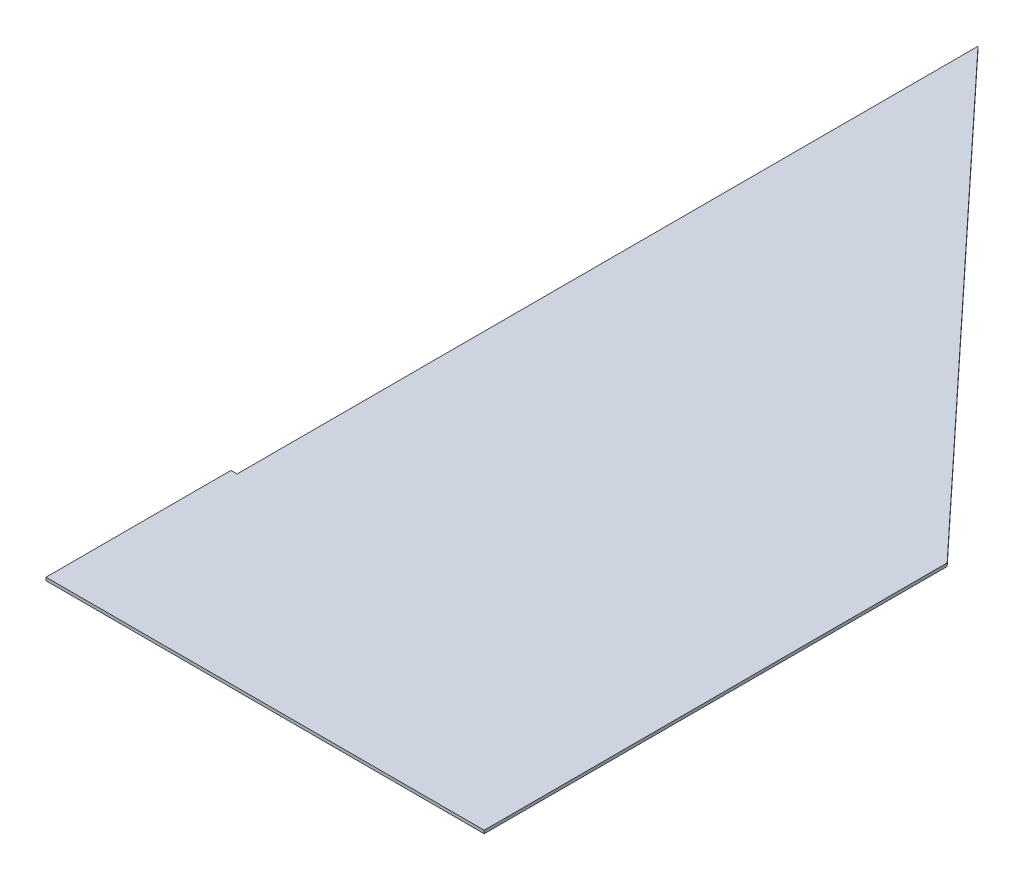
ISO-10303-21;
HEADER;
FILE_DESCRIPTION(('STEP AP214'),'2;1');
FILE_NAME('part.step','',(''),(''),'','','');
FILE_SCHEMA(('AUTOMOTIVE_DESIGN { 1 0 10303 214 1 1 1 1 }'));
ENDSEC;
DATA;
#1=APPLICATION_CONTEXT('core data for automotive mechanical design processes');
#2=APPLICATION_PROTOCOL_DEFINITION('international standard','automotive_design',2000,#1);
#3=PRODUCT_CONTEXT('',#1,'mechanical');
#4=PRODUCT('Part','Part','',(#3));
#5=PRODUCT_RELATED_PRODUCT_CATEGORY('part','',(#4));
#6=PRODUCT_DEFINITION_FORMATION('','',#4);
#7=PRODUCT_DEFINITION_CONTEXT('part definition',#1,'design');
#8=PRODUCT_DEFINITION('design','',#6,#7);
#9=PRODUCT_DEFINITION_SHAPE('','',#8);
#10=(LENGTH_UNIT() NAMED_UNIT(*) SI_UNIT(.MILLI.,.METRE.));
#11=(NAMED_UNIT(*) PLANE_ANGLE_UNIT() SI_UNIT($,.RADIAN.));
#12=(NAMED_UNIT(*) SI_UNIT($,.STERADIAN.) SOLID_ANGLE_UNIT());
#13=UNCERTAINTY_MEASURE_WITH_UNIT(LENGTH_MEASURE(1.E-05),#10,'distance_accuracy_value','');
#14=(GEOMETRIC_REPRESENTATION_CONTEXT(3) GLOBAL_UNCERTAINTY_ASSIGNED_CONTEXT((#13)) GLOBAL_UNIT_ASSIGNED_CONTEXT((#10,
#11,#12)) REPRESENTATION_CONTEXT('',''));
#15=CARTESIAN_POINT('',(0.,0.,0.));
#16=DIRECTION('',(0.,0.,1.));
#17=DIRECTION('',(1.,0.,0.));
#18=AXIS2_PLACEMENT_3D('',#15,#16,#17);
#19=CARTESIAN_POINT('',(140.,1.,-150.));
#20=DIRECTION('',(-0.731055268242869,0.,0.682318250360011));
#21=DIRECTION('',(0.682318250360011,0.,0.731055268242869));
#22=AXIS2_PLACEMENT_3D('',#19,#20,#21);
#23=PLANE('',#22);
#24=DIRECTION('',(-0.682318250360011,0.,-0.731055268242869));
#25=VECTOR('',#24,1.);
#26=CARTESIAN_POINT('',(140.,0.,-150.));
#27=LINE('',#26,#25);
#28=CARTESIAN_POINT('',(140.,0.,-150.));
#29=VERTEX_POINT('',#28);
#30=CARTESIAN_POINT('',(0.,0.,-300.));
#31=VERTEX_POINT('',#30);
#32=EDGE_CURVE('E117',#29,#31,#27,.T.);
#33=ORIENTED_EDGE('',*,*,#32,.T.);
#34=DIRECTION('',(0.,-1.,0.));
#35=VECTOR('',#34,1.);
#36=CARTESIAN_POINT('',(0.,1.,-300.));
#37=LINE('',#36,#35);
#38=CARTESIAN_POINT('',(0.,1.,-300.));
#39=VERTEX_POINT('',#38);
#40=EDGE_CURVE('E11',#39,#31,#37,.T.);
#41=ORIENTED_EDGE('',*,*,#40,.F.);
#42=DIRECTION('',(-0.682318250360011,0.,-0.731055268242869));
#43=VECTOR('',#42,1.);
#44=CARTESIAN_POINT('',(140.,1.,-150.));
#45=LINE('',#44,#43);
#46=CARTESIAN_POINT('',(140.,1.,-150.));
#47=VERTEX_POINT('',#46);
#48=EDGE_CURVE('E127',#47,#39,#45,.T.);
#49=ORIENTED_EDGE('',*,*,#48,.F.);
#50=DIRECTION('',(0.,-1.,0.));
#51=VECTOR('',#50,1.);
#52=CARTESIAN_POINT('',(140.,1.,-150.));
#53=LINE('',#52,#51);
#54=EDGE_CURVE('E113',#47,#29,#53,.T.);
#55=ORIENTED_EDGE('',*,*,#54,.T.);
#56=EDGE_LOOP('',(#33,#41,#49,#55));
#57=FACE_BOUND('',#56,.T.);
#58=ADVANCED_FACE('F33',(#57),#23,.F.);
#59=CARTESIAN_POINT('',(0.,1.,-300.));
#60=DIRECTION('',(1.,0.,0.));
#61=DIRECTION('',(0.,0.,-1.));
#62=AXIS2_PLACEMENT_3D('',#59,#60,#61);
#63=PLANE('',#62);
#64=DIRECTION('',(0.,0.,1.));
#65=VECTOR('',#64,1.);
#66=CARTESIAN_POINT('',(0.,0.,-300.));
#67=LINE('',#66,#65);
#68=CARTESIAN_POINT('',(-5.55111512312578E-13,0.,-59.93));
#69=VERTEX_POINT('',#68);
#70=EDGE_CURVE('E120',#31,#69,#67,.T.);
#71=ORIENTED_EDGE('',*,*,#70,.T.);
#72=DIRECTION('',(0.,-1.,0.));
#73=VECTOR('',#72,1.);
#74=CARTESIAN_POINT('',(-5.55111512312578E-13,1.,-59.93));
#75=LINE('',#74,#73);
#76=CARTESIAN_POINT('',(-5.55111512312578E-13,1.,-59.93));
#77=VERTEX_POINT('',#76);
#78=EDGE_CURVE('E41',#77,#69,#75,.T.);
#79=ORIENTED_EDGE('',*,*,#78,.F.);
#80=DIRECTION('',(0.,0.,1.));
#81=VECTOR('',#80,1.);
#82=CARTESIAN_POINT('',(0.,1.,-300.));
#83=LINE('',#82,#81);
#84=EDGE_CURVE('E85',#39,#77,#83,.T.);
#85=ORIENTED_EDGE('',*,*,#84,.F.);
#86=ORIENTED_EDGE('',*,*,#40,.T.);
#87=EDGE_LOOP('',(#71,#79,#85,#86));
#88=FACE_BOUND('',#87,.T.);
#89=ADVANCED_FACE('F151',(#88),#63,.F.);
#90=CARTESIAN_POINT('',(-2.,1.,-59.93));
#91=DIRECTION('',(0.,0.,1.));
#92=DIRECTION('',(1.,0.,0.));
#93=AXIS2_PLACEMENT_3D('',#90,#91,#92);
#94=PLANE('',#93);
#95=DIRECTION('',(-1.,0.,0.));
#96=VECTOR('',#95,1.);
#97=CARTESIAN_POINT('',(-2.,0.,-59.93));
#98=LINE('',#97,#96);
#99=CARTESIAN_POINT('',(-2.,0.,-59.93));
#100=VERTEX_POINT('',#99);
#101=EDGE_CURVE('E122',#69,#100,#98,.T.);
#102=ORIENTED_EDGE('',*,*,#101,.T.);
#103=DIRECTION('',(0.,-1.,0.));
#104=VECTOR('',#103,1.);
#105=CARTESIAN_POINT('',(-2.,1.,-59.93));
#106=LINE('',#105,#104);
#107=CARTESIAN_POINT('',(-2.,1.,-59.93));
#108=VERTEX_POINT('',#107);
#109=EDGE_CURVE('E108',#108,#100,#106,.T.);
#110=ORIENTED_EDGE('',*,*,#109,.F.);
#111=DIRECTION('',(-1.,0.,0.));
#112=VECTOR('',#111,1.);
#113=CARTESIAN_POINT('',(-2.,1.,-59.93));
#114=LINE('',#113,#112);
#115=EDGE_CURVE('E98',#77,#108,#114,.T.);
#116=ORIENTED_EDGE('',*,*,#115,.F.);
#117=ORIENTED_EDGE('',*,*,#78,.T.);
#118=EDGE_LOOP('',(#102,#110,#116,#117));
#119=FACE_BOUND('',#118,.T.);
#120=ADVANCED_FACE('F133',(#119),#94,.F.);
#121=CARTESIAN_POINT('',(-2.,1.,0.));
#122=DIRECTION('',(1.,0.,0.));
#123=DIRECTION('',(0.,0.,-1.));
#124=AXIS2_PLACEMENT_3D('',#121,#122,#123);
#125=PLANE('',#124);
#126=DIRECTION('',(0.,0.,1.));
#127=VECTOR('',#126,1.);
#128=CARTESIAN_POINT('',(-2.,0.,0.));
#129=LINE('',#128,#127);
#130=CARTESIAN_POINT('',(-2.,0.,0.));
#131=VERTEX_POINT('',#130);
#132=EDGE_CURVE('E107',#100,#131,#129,.T.);
#133=ORIENTED_EDGE('',*,*,#132,.T.);
#134=DIRECTION('',(0.,-1.,0.));
#135=VECTOR('',#134,1.);
#136=CARTESIAN_POINT('',(-2.,1.,0.));
#137=LINE('',#136,#135);
#138=CARTESIAN_POINT('',(-2.,1.,0.));
#139=VERTEX_POINT('',#138);
#140=EDGE_CURVE('E104',#139,#131,#137,.T.);
#141=ORIENTED_EDGE('',*,*,#140,.F.);
#142=DIRECTION('',(0.,0.,1.));
#143=VECTOR('',#142,1.);
#144=CARTESIAN_POINT('',(-2.,1.,0.));
#145=LINE('',#144,#143);
#146=EDGE_CURVE('E92',#108,#139,#145,.T.);
#147=ORIENTED_EDGE('',*,*,#146,.F.);
#148=ORIENTED_EDGE('',*,*,#109,.T.);
#149=EDGE_LOOP('',(#133,#141,#147,#148));
#150=FACE_BOUND('',#149,.T.);
#151=ADVANCED_FACE('F105',(#150),#125,.F.);
#152=CARTESIAN_POINT('',(0.,1.,0.));
#153=DIRECTION('',(0.,0.,-1.));
#154=DIRECTION('',(-1.,0.,0.));
#155=AXIS2_PLACEMENT_3D('',#152,#153,#154);
#156=PLANE('',#155);
#157=DIRECTION('',(1.,0.,0.));
#158=VECTOR('',#157,1.);
#159=CARTESIAN_POINT('',(0.,0.,0.));
#160=LINE('',#159,#158);
#161=CARTESIAN_POINT('',(140.,0.,0.));
#162=VERTEX_POINT('',#161);
#163=EDGE_CURVE('E71',#131,#162,#160,.T.);
#164=ORIENTED_EDGE('',*,*,#163,.T.);
#165=DIRECTION('',(0.,-1.,0.));
#166=VECTOR('',#165,1.);
#167=CARTESIAN_POINT('',(140.,1.,0.));
#168=LINE('',#167,#166);
#169=CARTESIAN_POINT('',(140.,1.,0.));
#170=VERTEX_POINT('',#169);
#171=EDGE_CURVE('E109',#170,#162,#168,.T.);
#172=ORIENTED_EDGE('',*,*,#171,.F.);
#173=DIRECTION('',(1.,0.,0.));
#174=VECTOR('',#173,1.);
#175=CARTESIAN_POINT('',(0.,1.,0.));
#176=LINE('',#175,#174);
#177=EDGE_CURVE('E96',#139,#170,#176,.T.);
#178=ORIENTED_EDGE('',*,*,#177,.F.);
#179=ORIENTED_EDGE('',*,*,#140,.T.);
#180=EDGE_LOOP('',(#164,#172,#178,#179));
#181=FACE_BOUND('',#180,.T.);
#182=ADVANCED_FACE('F111',(#181),#156,.F.);
#183=CARTESIAN_POINT('',(140.,1.,0.));
#184=DIRECTION('',(-1.,0.,0.));
#185=DIRECTION('',(0.,0.,1.));
#186=AXIS2_PLACEMENT_3D('',#183,#184,#185);
#187=PLANE('',#186);
#188=DIRECTION('',(0.,0.,-1.));
#189=VECTOR('',#188,1.);
#190=CARTESIAN_POINT('',(140.,0.,0.));
#191=LINE('',#190,#189);
#192=EDGE_CURVE('E77',#162,#29,#191,.T.);
#193=ORIENTED_EDGE('',*,*,#192,.T.);
#194=ORIENTED_EDGE('',*,*,#54,.F.);
#195=DIRECTION('',(0.,0.,-1.));
#196=VECTOR('',#195,1.);
#197=CARTESIAN_POINT('',(140.,1.,0.));
#198=LINE('',#197,#196);
#199=EDGE_CURVE('E49',#170,#47,#198,.T.);
#200=ORIENTED_EDGE('',*,*,#199,.F.);
#201=ORIENTED_EDGE('',*,*,#171,.T.);
#202=EDGE_LOOP('',(#193,#194,#200,#201));
#203=FACE_BOUND('',#202,.T.);
#204=ADVANCED_FACE('F140',(#203),#187,.F.);
#205=CARTESIAN_POINT('',(0.,1.,0.));
#206=DIRECTION('',(0.,-1.,0.));
#207=DIRECTION('',(0.,0.,-1.));
#208=AXIS2_PLACEMENT_3D('',#205,#206,#207);
#209=PLANE('',#208);
#210=ORIENTED_EDGE('',*,*,#48,.T.);
#211=ORIENTED_EDGE('',*,*,#84,.T.);
#212=ORIENTED_EDGE('',*,*,#115,.T.);
#213=ORIENTED_EDGE('',*,*,#146,.T.);
#214=ORIENTED_EDGE('',*,*,#177,.T.);
#215=ORIENTED_EDGE('',*,*,#199,.T.);
#216=EDGE_LOOP('',(#210,#211,#212,#213,#214,#215));
#217=FACE_BOUND('',#216,.T.);
#218=ADVANCED_FACE('F94',(#217),#209,.F.);
#219=CARTESIAN_POINT('',(0.,0.,0.));
#220=DIRECTION('',(0.,-1.,0.));
#221=DIRECTION('',(0.,0.,-1.));
#222=AXIS2_PLACEMENT_3D('',#219,#220,#221);
#223=PLANE('',#222);
#224=ORIENTED_EDGE('',*,*,#32,.F.);
#225=ORIENTED_EDGE('',*,*,#192,.F.);
#226=ORIENTED_EDGE('',*,*,#163,.F.);
#227=ORIENTED_EDGE('',*,*,#132,.F.);
#228=ORIENTED_EDGE('',*,*,#101,.F.);
#229=ORIENTED_EDGE('',*,*,#70,.F.);
#230=EDGE_LOOP('',(#224,#225,#226,#227,#228,#229));
#231=FACE_BOUND('',#230,.T.);
#232=ADVANCED_FACE('F136',(#231),#223,.T.);
#233=CLOSED_SHELL('',(#58,#89,#120,#151,#182,#204,#218,#232));
#234=MANIFOLD_SOLID_BREP('B2',#233);
#235=ADVANCED_BREP_SHAPE_REPRESENTATION('',(#18,#234),#14);
#236=SHAPE_DEFINITION_REPRESENTATION(#9,#235);
ENDSEC;
END-ISO-10303-21;
